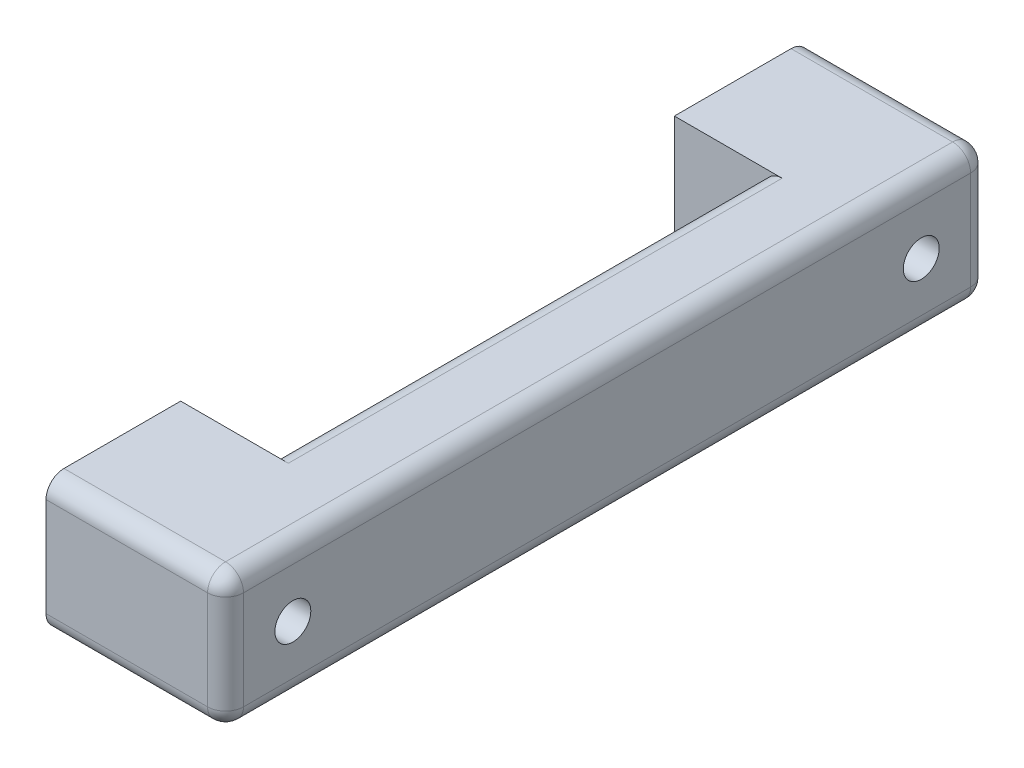
ISO-10303-21;
HEADER;
FILE_DESCRIPTION(('STEP AP214'),'2;1');
FILE_NAME('part.step','',(''),(''),'','','');
FILE_SCHEMA(('AUTOMOTIVE_DESIGN { 1 0 10303 214 1 1 1 1 }'));
ENDSEC;
DATA;
#1=APPLICATION_CONTEXT('core data for automotive mechanical design processes');
#2=APPLICATION_PROTOCOL_DEFINITION('international standard','automotive_design',2000,#1);
#3=PRODUCT_CONTEXT('',#1,'mechanical');
#4=PRODUCT('Part','Part','',(#3));
#5=PRODUCT_RELATED_PRODUCT_CATEGORY('part','',(#4));
#6=PRODUCT_DEFINITION_FORMATION('','',#4);
#7=PRODUCT_DEFINITION_CONTEXT('part definition',#1,'design');
#8=PRODUCT_DEFINITION('design','',#6,#7);
#9=PRODUCT_DEFINITION_SHAPE('','',#8);
#10=(LENGTH_UNIT() NAMED_UNIT(*) SI_UNIT(.MILLI.,.METRE.));
#11=(NAMED_UNIT(*) PLANE_ANGLE_UNIT() SI_UNIT($,.RADIAN.));
#12=(NAMED_UNIT(*) SI_UNIT($,.STERADIAN.) SOLID_ANGLE_UNIT());
#13=UNCERTAINTY_MEASURE_WITH_UNIT(LENGTH_MEASURE(1.E-05),#10,'distance_accuracy_value','');
#14=(GEOMETRIC_REPRESENTATION_CONTEXT(3) GLOBAL_UNCERTAINTY_ASSIGNED_CONTEXT((#13)) GLOBAL_UNIT_ASSIGNED_CONTEXT((#10,
#11,#12)) REPRESENTATION_CONTEXT('',''));
#15=CARTESIAN_POINT('',(0.,0.,0.));
#16=DIRECTION('',(0.,0.,1.));
#17=DIRECTION('',(1.,0.,0.));
#18=AXIS2_PLACEMENT_3D('',#15,#16,#17);
#19=CARTESIAN_POINT('',(0.,0.,0.));
#20=DIRECTION('',(1.,0.,0.));
#21=DIRECTION('',(0.,0.,-1.));
#22=AXIS2_PLACEMENT_3D('',#19,#20,#21);
#23=PLANE('',#22);
#24=DIRECTION('',(0.,-1.,0.));
#25=VECTOR('',#24,1.);
#26=CARTESIAN_POINT('',(0.,7.5,27.5));
#27=LINE('',#26,#25);
#28=CARTESIAN_POINT('',(0.,5.5,27.5));
#29=VERTEX_POINT('',#28);
#30=CARTESIAN_POINT('',(0.,-5.5,27.5));
#31=VERTEX_POINT('',#30);
#32=EDGE_CURVE('E187',#29,#31,#27,.T.);
#33=ORIENTED_EDGE('',*,*,#32,.F.);
#34=DIRECTION('',(0.,0.,1.));
#35=VECTOR('',#34,1.);
#36=CARTESIAN_POINT('',(0.,5.5,0.));
#37=LINE('',#36,#35);
#38=CARTESIAN_POINT('',(0.,5.5,-27.5));
#39=VERTEX_POINT('',#38);
#40=EDGE_CURVE('E215',#29,#39,#37,.F.);
#41=ORIENTED_EDGE('',*,*,#40,.T.);
#42=DIRECTION('',(0.,1.,0.));
#43=VECTOR('',#42,1.);
#44=CARTESIAN_POINT('',(0.,7.5,-27.5));
#45=LINE('',#44,#43);
#46=CARTESIAN_POINT('',(0.,-5.5,-27.5));
#47=VERTEX_POINT('',#46);
#48=EDGE_CURVE('E184',#47,#39,#45,.T.);
#49=ORIENTED_EDGE('',*,*,#48,.F.);
#50=DIRECTION('',(0.,0.,-1.));
#51=VECTOR('',#50,1.);
#52=CARTESIAN_POINT('',(0.,-5.5,0.));
#53=LINE('',#52,#51);
#54=EDGE_CURVE('E213',#47,#31,#53,.F.);
#55=ORIENTED_EDGE('',*,*,#54,.T.);
#56=EDGE_LOOP('',(#33,#41,#49,#55));
#57=FACE_BOUND('',#56,.T.);
#58=ADVANCED_FACE('F39',(#57),#23,.F.);
#59=CARTESIAN_POINT('',(10.,7.5,-42.5));
#60=DIRECTION('',(0.,0.,1.));
#61=DIRECTION('',(1.,0.,0.));
#62=AXIS2_PLACEMENT_3D('',#59,#60,#61);
#63=PLANE('',#62);
#64=DIRECTION('',(0.,1.,0.));
#65=VECTOR('',#64,1.);
#66=CARTESIAN_POINT('',(8.,-7.5,-42.5));
#67=LINE('',#66,#65);
#68=CARTESIAN_POINT('',(8.,5.5,-42.5));
#69=VERTEX_POINT('',#68);
#70=CARTESIAN_POINT('',(8.,-5.5,-42.5));
#71=VERTEX_POINT('',#70);
#72=EDGE_CURVE('E235',#69,#71,#67,.F.);
#73=ORIENTED_EDGE('',*,*,#72,.T.);
#74=DIRECTION('',(-1.,0.,0.));
#75=VECTOR('',#74,1.);
#76=CARTESIAN_POINT('',(10.,-5.5,-42.5));
#77=LINE('',#76,#75);
#78=CARTESIAN_POINT('',(-10.,-5.5,-42.5));
#79=VERTEX_POINT('',#78);
#80=EDGE_CURVE('E238',#71,#79,#77,.T.);
#81=ORIENTED_EDGE('',*,*,#80,.T.);
#82=DIRECTION('',(0.,-1.,0.));
#83=VECTOR('',#82,1.);
#84=CARTESIAN_POINT('',(-10.,7.5,-42.5));
#85=LINE('',#84,#83);
#86=CARTESIAN_POINT('',(-10.,5.5,-42.5));
#87=VERTEX_POINT('',#86);
#88=EDGE_CURVE('E164',#87,#79,#85,.T.);
#89=ORIENTED_EDGE('',*,*,#88,.F.);
#90=DIRECTION('',(-1.,0.,0.));
#91=VECTOR('',#90,1.);
#92=CARTESIAN_POINT('',(10.,5.5,-42.5));
#93=LINE('',#92,#91);
#94=EDGE_CURVE('E233',#87,#69,#93,.F.);
#95=ORIENTED_EDGE('',*,*,#94,.T.);
#96=EDGE_LOOP('',(#73,#81,#89,#95));
#97=FACE_BOUND('',#96,.T.);
#98=ADVANCED_FACE('F348',(#97),#63,.F.);
#99=CARTESIAN_POINT('',(10.,7.5,42.5));
#100=DIRECTION('',(0.,-1.,0.));
#101=DIRECTION('',(0.,0.,-1.));
#102=AXIS2_PLACEMENT_3D('',#99,#100,#101);
#103=PLANE('',#102);
#104=DIRECTION('',(0.,0.,1.));
#105=VECTOR('',#104,1.);
#106=CARTESIAN_POINT('',(2.,7.5,42.5));
#107=LINE('',#106,#105);
#108=CARTESIAN_POINT('',(2.,7.5,-27.5));
#109=VERTEX_POINT('',#108);
#110=CARTESIAN_POINT('',(2.,7.5,27.5));
#111=VERTEX_POINT('',#110);
#112=EDGE_CURVE('E210',#109,#111,#107,.T.);
#113=ORIENTED_EDGE('',*,*,#112,.T.);
#114=DIRECTION('',(1.,0.,0.));
#115=VECTOR('',#114,1.);
#116=CARTESIAN_POINT('',(-10.,7.5,27.5));
#117=LINE('',#116,#115);
#118=CARTESIAN_POINT('',(-10.,7.5,27.5));
#119=VERTEX_POINT('',#118);
#120=EDGE_CURVE('E189',#119,#111,#117,.T.);
#121=ORIENTED_EDGE('',*,*,#120,.F.);
#122=DIRECTION('',(0.,0.,-1.));
#123=VECTOR('',#122,1.);
#124=CARTESIAN_POINT('',(-10.,7.5,42.5));
#125=LINE('',#124,#123);
#126=CARTESIAN_POINT('',(-10.,7.5,40.5));
#127=VERTEX_POINT('',#126);
#128=EDGE_CURVE('E196',#127,#119,#125,.T.);
#129=ORIENTED_EDGE('',*,*,#128,.F.);
#130=DIRECTION('',(-1.,0.,0.));
#131=VECTOR('',#130,1.);
#132=CARTESIAN_POINT('',(10.,7.5,40.5));
#133=LINE('',#132,#131);
#134=CARTESIAN_POINT('',(8.,7.5,40.5));
#135=VERTEX_POINT('',#134);
#136=EDGE_CURVE('E208',#127,#135,#133,.F.);
#137=ORIENTED_EDGE('',*,*,#136,.T.);
#138=DIRECTION('',(0.,0.,1.));
#139=VECTOR('',#138,1.);
#140=CARTESIAN_POINT('',(8.,7.5,-42.5));
#141=LINE('',#140,#139);
#142=CARTESIAN_POINT('',(8.,7.5,-40.5));
#143=VERTEX_POINT('',#142);
#144=EDGE_CURVE('E206',#135,#143,#141,.F.);
#145=ORIENTED_EDGE('',*,*,#144,.T.);
#146=DIRECTION('',(-1.,0.,0.));
#147=VECTOR('',#146,1.);
#148=CARTESIAN_POINT('',(10.,7.5,-40.5));
#149=LINE('',#148,#147);
#150=CARTESIAN_POINT('',(-10.,7.5,-40.5));
#151=VERTEX_POINT('',#150);
#152=EDGE_CURVE('E173',#143,#151,#149,.T.);
#153=ORIENTED_EDGE('',*,*,#152,.T.);
#154=DIRECTION('',(0.,0.,-1.));
#155=VECTOR('',#154,1.);
#156=CARTESIAN_POINT('',(-10.,7.5,-42.5));
#157=LINE('',#156,#155);
#158=CARTESIAN_POINT('',(-10.,7.5,-27.5));
#159=VERTEX_POINT('',#158);
#160=EDGE_CURVE('E179',#159,#151,#157,.T.);
#161=ORIENTED_EDGE('',*,*,#160,.F.);
#162=DIRECTION('',(1.,0.,0.));
#163=VECTOR('',#162,1.);
#164=CARTESIAN_POINT('',(-10.,7.5,-27.5));
#165=LINE('',#164,#163);
#166=EDGE_CURVE('E174',#159,#109,#165,.T.);
#167=ORIENTED_EDGE('',*,*,#166,.T.);
#168=EDGE_LOOP('',(#113,#121,#129,#137,#145,#153,#161,#167));
#169=FACE_BOUND('',#168,.T.);
#170=ADVANCED_FACE('F341',(#169),#103,.F.);
#171=CARTESIAN_POINT('',(10.,7.5,42.5));
#172=DIRECTION('',(0.,0.,-1.));
#173=DIRECTION('',(-1.,0.,0.));
#174=AXIS2_PLACEMENT_3D('',#171,#172,#173);
#175=PLANE('',#174);
#176=DIRECTION('',(0.,1.,0.));
#177=VECTOR('',#176,1.);
#178=CARTESIAN_POINT('',(-10.,7.5,42.5));
#179=LINE('',#178,#177);
#180=CARTESIAN_POINT('',(-10.,-5.5,42.5));
#181=VERTEX_POINT('',#180);
#182=CARTESIAN_POINT('',(-10.,5.5,42.5));
#183=VERTEX_POINT('',#182);
#184=EDGE_CURVE('E193',#181,#183,#179,.T.);
#185=ORIENTED_EDGE('',*,*,#184,.F.);
#186=DIRECTION('',(-1.,0.,0.));
#187=VECTOR('',#186,1.);
#188=CARTESIAN_POINT('',(10.,-5.5,42.5));
#189=LINE('',#188,#187);
#190=CARTESIAN_POINT('',(8.,-5.5,42.5));
#191=VERTEX_POINT('',#190);
#192=EDGE_CURVE('E61',#181,#191,#189,.F.);
#193=ORIENTED_EDGE('',*,*,#192,.T.);
#194=DIRECTION('',(0.,-1.,0.));
#195=VECTOR('',#194,1.);
#196=CARTESIAN_POINT('',(8.,7.5,42.5));
#197=LINE('',#196,#195);
#198=CARTESIAN_POINT('',(8.,5.5,42.5));
#199=VERTEX_POINT('',#198);
#200=EDGE_CURVE('E56',#191,#199,#197,.F.);
#201=ORIENTED_EDGE('',*,*,#200,.T.);
#202=DIRECTION('',(-1.,0.,0.));
#203=VECTOR('',#202,1.);
#204=CARTESIAN_POINT('',(10.,5.5,42.5));
#205=LINE('',#204,#203);
#206=EDGE_CURVE('E248',#199,#183,#205,.T.);
#207=ORIENTED_EDGE('',*,*,#206,.T.);
#208=EDGE_LOOP('',(#185,#193,#201,#207));
#209=FACE_BOUND('',#208,.T.);
#210=ADVANCED_FACE('F318',(#209),#175,.F.);
#211=CARTESIAN_POINT('',(10.,-7.5,42.5));
#212=DIRECTION('',(0.,1.,0.));
#213=DIRECTION('',(0.,0.,1.));
#214=AXIS2_PLACEMENT_3D('',#211,#212,#213);
#215=PLANE('',#214);
#216=DIRECTION('',(0.,0.,-1.));
#217=VECTOR('',#216,1.);
#218=CARTESIAN_POINT('',(2.,-7.5,42.5));
#219=LINE('',#218,#217);
#220=CARTESIAN_POINT('',(2.,-7.5,27.5));
#221=VERTEX_POINT('',#220);
#222=CARTESIAN_POINT('',(2.,-7.5,-27.5));
#223=VERTEX_POINT('',#222);
#224=EDGE_CURVE('E170',#221,#223,#219,.T.);
#225=ORIENTED_EDGE('',*,*,#224,.T.);
#226=DIRECTION('',(1.,0.,0.));
#227=VECTOR('',#226,1.);
#228=CARTESIAN_POINT('',(-10.,-7.5,-27.5));
#229=LINE('',#228,#227);
#230=CARTESIAN_POINT('',(-10.,-7.5,-27.5));
#231=VERTEX_POINT('',#230);
#232=EDGE_CURVE('E167',#231,#223,#229,.T.);
#233=ORIENTED_EDGE('',*,*,#232,.F.);
#234=DIRECTION('',(0.,0.,1.));
#235=VECTOR('',#234,1.);
#236=CARTESIAN_POINT('',(-10.,-7.5,-42.5));
#237=LINE('',#236,#235);
#238=CARTESIAN_POINT('',(-10.,-7.5,-40.5));
#239=VERTEX_POINT('',#238);
#240=EDGE_CURVE('E152',#239,#231,#237,.T.);
#241=ORIENTED_EDGE('',*,*,#240,.F.);
#242=DIRECTION('',(-1.,0.,0.));
#243=VECTOR('',#242,1.);
#244=CARTESIAN_POINT('',(10.,-7.5,-40.5));
#245=LINE('',#244,#243);
#246=CARTESIAN_POINT('',(8.,-7.5,-40.5));
#247=VERTEX_POINT('',#246);
#248=EDGE_CURVE('E221',#239,#247,#245,.F.);
#249=ORIENTED_EDGE('',*,*,#248,.T.);
#250=DIRECTION('',(0.,0.,-1.));
#251=VECTOR('',#250,1.);
#252=CARTESIAN_POINT('',(8.,-7.5,42.5));
#253=LINE('',#252,#251);
#254=CARTESIAN_POINT('',(8.,-7.5,40.5));
#255=VERTEX_POINT('',#254);
#256=EDGE_CURVE('E219',#247,#255,#253,.F.);
#257=ORIENTED_EDGE('',*,*,#256,.T.);
#258=DIRECTION('',(-1.,0.,0.));
#259=VECTOR('',#258,1.);
#260=CARTESIAN_POINT('',(10.,-7.5,40.5));
#261=LINE('',#260,#259);
#262=CARTESIAN_POINT('',(-10.,-7.5,40.5));
#263=VERTEX_POINT('',#262);
#264=EDGE_CURVE('E217',#255,#263,#261,.T.);
#265=ORIENTED_EDGE('',*,*,#264,.T.);
#266=DIRECTION('',(0.,0.,1.));
#267=VECTOR('',#266,1.);
#268=CARTESIAN_POINT('',(-10.,-7.5,42.5));
#269=LINE('',#268,#267);
#270=CARTESIAN_POINT('',(-10.,-7.5,27.5));
#271=VERTEX_POINT('',#270);
#272=EDGE_CURVE('E199',#271,#263,#269,.T.);
#273=ORIENTED_EDGE('',*,*,#272,.F.);
#274=DIRECTION('',(1.,0.,0.));
#275=VECTOR('',#274,1.);
#276=CARTESIAN_POINT('',(-10.,-7.5,27.5));
#277=LINE('',#276,#275);
#278=EDGE_CURVE('E191',#271,#221,#277,.T.);
#279=ORIENTED_EDGE('',*,*,#278,.T.);
#280=EDGE_LOOP('',(#225,#233,#241,#249,#257,#265,#273,#279));
#281=FACE_BOUND('',#280,.T.);
#282=ADVANCED_FACE('F168',(#281),#215,.F.);
#283=CARTESIAN_POINT('',(10.,0.,0.));
#284=DIRECTION('',(1.,0.,0.));
#285=DIRECTION('',(0.,0.,-1.));
#286=AXIS2_PLACEMENT_3D('',#283,#284,#285);
#287=PLANE('',#286);
#288=CARTESIAN_POINT('',(10.,0.,-35.));
#289=DIRECTION('',(-1.,0.,0.));
#290=DIRECTION('',(0.,0.,1.));
#291=AXIS2_PLACEMENT_3D('',#288,#289,#290);
#292=CIRCLE('',#291,2.);
#293=CARTESIAN_POINT('',(10.,0.,-33.));
#294=VERTEX_POINT('',#293);
#295=EDGE_CURVE('E259',#294,#294,#292,.T.);
#296=ORIENTED_EDGE('',*,*,#295,.T.);
#297=EDGE_LOOP('',(#296));
#298=FACE_BOUND('',#297,.T.);
#299=CARTESIAN_POINT('',(10.,0.,35.));
#300=DIRECTION('',(-1.,0.,0.));
#301=DIRECTION('',(0.,0.,-1.));
#302=AXIS2_PLACEMENT_3D('',#299,#300,#301);
#303=CIRCLE('',#302,2.);
#304=CARTESIAN_POINT('',(10.,0.,33.));
#305=VERTEX_POINT('',#304);
#306=EDGE_CURVE('E350',#305,#305,#303,.T.);
#307=ORIENTED_EDGE('',*,*,#306,.T.);
#308=EDGE_LOOP('',(#307));
#309=FACE_BOUND('',#308,.T.);
#310=DIRECTION('',(0.,0.,-1.));
#311=VECTOR('',#310,1.);
#312=CARTESIAN_POINT('',(10.,-5.5,-42.5));
#313=LINE('',#312,#311);
#314=CARTESIAN_POINT('',(10.,-5.5,40.5));
#315=VERTEX_POINT('',#314);
#316=CARTESIAN_POINT('',(10.,-5.5,-40.5));
#317=VERTEX_POINT('',#316);
#318=EDGE_CURVE('E226',#315,#317,#313,.T.);
#319=ORIENTED_EDGE('',*,*,#318,.T.);
#320=DIRECTION('',(0.,1.,0.));
#321=VECTOR('',#320,1.);
#322=CARTESIAN_POINT('',(10.,7.5,-40.5));
#323=LINE('',#322,#321);
#324=CARTESIAN_POINT('',(10.,5.5,-40.5));
#325=VERTEX_POINT('',#324);
#326=EDGE_CURVE('E230',#317,#325,#323,.T.);
#327=ORIENTED_EDGE('',*,*,#326,.T.);
#328=DIRECTION('',(0.,0.,1.));
#329=VECTOR('',#328,1.);
#330=CARTESIAN_POINT('',(10.,5.5,42.5));
#331=LINE('',#330,#329);
#332=CARTESIAN_POINT('',(10.,5.5,40.5));
#333=VERTEX_POINT('',#332);
#334=EDGE_CURVE('E228',#325,#333,#331,.T.);
#335=ORIENTED_EDGE('',*,*,#334,.T.);
#336=DIRECTION('',(0.,-1.,0.));
#337=VECTOR('',#336,1.);
#338=CARTESIAN_POINT('',(10.,-7.5,40.5));
#339=LINE('',#338,#337);
#340=EDGE_CURVE('E224',#333,#315,#339,.T.);
#341=ORIENTED_EDGE('',*,*,#340,.T.);
#342=EDGE_LOOP('',(#319,#327,#335,#341));
#343=FACE_BOUND('',#342,.T.);
#344=ADVANCED_FACE('F302',(#298,#309,#343),#287,.T.);
#345=CARTESIAN_POINT('',(-10.,7.5,27.5));
#346=DIRECTION('',(0.,0.,1.));
#347=DIRECTION('',(1.,0.,0.));
#348=AXIS2_PLACEMENT_3D('',#345,#346,#347);
#349=PLANE('',#348);
#350=ORIENTED_EDGE('',*,*,#120,.T.);
#351=CARTESIAN_POINT('',(2.,5.5,27.5));
#352=DIRECTION('',(0.,0.,1.));
#353=DIRECTION('',(1.,0.,0.));
#354=AXIS2_PLACEMENT_3D('',#351,#352,#353);
#355=CIRCLE('',#354,2.);
#356=EDGE_CURVE('E251',#111,#29,#355,.T.);
#357=ORIENTED_EDGE('',*,*,#356,.T.);
#358=ORIENTED_EDGE('',*,*,#32,.T.);
#359=CARTESIAN_POINT('',(2.,-5.5,27.5));
#360=DIRECTION('',(0.,0.,1.));
#361=DIRECTION('',(1.,0.,0.));
#362=AXIS2_PLACEMENT_3D('',#359,#360,#361);
#363=CIRCLE('',#362,2.);
#364=EDGE_CURVE('E11',#31,#221,#363,.T.);
#365=ORIENTED_EDGE('',*,*,#364,.T.);
#366=ORIENTED_EDGE('',*,*,#278,.F.);
#367=DIRECTION('',(0.,-1.,0.));
#368=VECTOR('',#367,1.);
#369=CARTESIAN_POINT('',(-10.,7.5,27.5));
#370=LINE('',#369,#368);
#371=EDGE_CURVE('E202',#119,#271,#370,.T.);
#372=ORIENTED_EDGE('',*,*,#371,.F.);
#373=EDGE_LOOP('',(#350,#357,#358,#365,#366,#372));
#374=FACE_BOUND('',#373,.T.);
#375=ADVANCED_FACE('F449',(#374),#349,.F.);
#376=CARTESIAN_POINT('',(-10.,0.,0.));
#377=DIRECTION('',(-1.,0.,0.));
#378=DIRECTION('',(0.,0.,1.));
#379=AXIS2_PLACEMENT_3D('',#376,#377,#378);
#380=PLANE('',#379);
#381=CARTESIAN_POINT('',(-10.,0.,35.));
#382=DIRECTION('',(-1.,0.,0.));
#383=DIRECTION('',(0.,0.,-1.));
#384=AXIS2_PLACEMENT_3D('',#381,#382,#383);
#385=CIRCLE('',#384,2.);
#386=CARTESIAN_POINT('',(-10.,0.,33.));
#387=VERTEX_POINT('',#386);
#388=EDGE_CURVE('E353',#387,#387,#385,.T.);
#389=ORIENTED_EDGE('',*,*,#388,.F.);
#390=EDGE_LOOP('',(#389));
#391=FACE_BOUND('',#390,.T.);
#392=ORIENTED_EDGE('',*,*,#272,.T.);
#393=CARTESIAN_POINT('',(-10.,-5.5,40.5));
#394=DIRECTION('',(-1.,0.,0.));
#395=DIRECTION('',(0.,0.,1.));
#396=AXIS2_PLACEMENT_3D('',#393,#394,#395);
#397=CIRCLE('',#396,2.);
#398=EDGE_CURVE('E245',#263,#181,#397,.T.);
#399=ORIENTED_EDGE('',*,*,#398,.T.);
#400=ORIENTED_EDGE('',*,*,#184,.T.);
#401=CARTESIAN_POINT('',(-10.,5.5,40.5));
#402=DIRECTION('',(-1.,0.,0.));
#403=DIRECTION('',(0.,0.,1.));
#404=AXIS2_PLACEMENT_3D('',#401,#402,#403);
#405=CIRCLE('',#404,2.);
#406=EDGE_CURVE('E243',#183,#127,#405,.T.);
#407=ORIENTED_EDGE('',*,*,#406,.T.);
#408=ORIENTED_EDGE('',*,*,#128,.T.);
#409=ORIENTED_EDGE('',*,*,#371,.T.);
#410=EDGE_LOOP('',(#392,#399,#400,#407,#408,#409));
#411=FACE_BOUND('',#410,.T.);
#412=ADVANCED_FACE('F320',(#391,#411),#380,.T.);
#413=CARTESIAN_POINT('',(-10.,7.5,-27.5));
#414=DIRECTION('',(0.,0.,-1.));
#415=DIRECTION('',(-1.,0.,0.));
#416=AXIS2_PLACEMENT_3D('',#413,#414,#415);
#417=PLANE('',#416);
#418=ORIENTED_EDGE('',*,*,#232,.T.);
#419=CARTESIAN_POINT('',(2.,-5.5,-27.5));
#420=DIRECTION('',(0.,0.,-1.));
#421=DIRECTION('',(-1.,0.,0.));
#422=AXIS2_PLACEMENT_3D('',#419,#420,#421);
#423=CIRCLE('',#422,2.);
#424=EDGE_CURVE('E48',#223,#47,#423,.T.);
#425=ORIENTED_EDGE('',*,*,#424,.T.);
#426=ORIENTED_EDGE('',*,*,#48,.T.);
#427=CARTESIAN_POINT('',(2.,5.5,-27.5));
#428=DIRECTION('',(0.,0.,-1.));
#429=DIRECTION('',(-1.,0.,0.));
#430=AXIS2_PLACEMENT_3D('',#427,#428,#429);
#431=CIRCLE('',#430,2.);
#432=EDGE_CURVE('E253',#39,#109,#431,.T.);
#433=ORIENTED_EDGE('',*,*,#432,.T.);
#434=ORIENTED_EDGE('',*,*,#166,.F.);
#435=DIRECTION('',(0.,1.,0.));
#436=VECTOR('',#435,1.);
#437=CARTESIAN_POINT('',(-10.,7.5,-27.5));
#438=LINE('',#437,#436);
#439=EDGE_CURVE('E158',#231,#159,#438,.T.);
#440=ORIENTED_EDGE('',*,*,#439,.F.);
#441=EDGE_LOOP('',(#418,#425,#426,#433,#434,#440));
#442=FACE_BOUND('',#441,.T.);
#443=ADVANCED_FACE('F176',(#442),#417,.F.);
#444=CARTESIAN_POINT('',(-10.,0.,0.));
#445=DIRECTION('',(-1.,0.,0.));
#446=DIRECTION('',(0.,0.,1.));
#447=AXIS2_PLACEMENT_3D('',#444,#445,#446);
#448=PLANE('',#447);
#449=CARTESIAN_POINT('',(-10.,0.,-35.));
#450=DIRECTION('',(-1.,0.,0.));
#451=DIRECTION('',(0.,0.,1.));
#452=AXIS2_PLACEMENT_3D('',#449,#450,#451);
#453=CIRCLE('',#452,2.);
#454=CARTESIAN_POINT('',(-10.,0.,-33.));
#455=VERTEX_POINT('',#454);
#456=EDGE_CURVE('E356',#455,#455,#453,.T.);
#457=ORIENTED_EDGE('',*,*,#456,.F.);
#458=EDGE_LOOP('',(#457));
#459=FACE_BOUND('',#458,.T.);
#460=ORIENTED_EDGE('',*,*,#88,.T.);
#461=CARTESIAN_POINT('',(-10.,-5.5,-40.5));
#462=DIRECTION('',(-1.,0.,0.));
#463=DIRECTION('',(0.,0.,1.));
#464=AXIS2_PLACEMENT_3D('',#461,#462,#463);
#465=CIRCLE('',#464,2.);
#466=EDGE_CURVE('E161',#79,#239,#465,.T.);
#467=ORIENTED_EDGE('',*,*,#466,.T.);
#468=ORIENTED_EDGE('',*,*,#240,.T.);
#469=ORIENTED_EDGE('',*,*,#439,.T.);
#470=ORIENTED_EDGE('',*,*,#160,.T.);
#471=CARTESIAN_POINT('',(-10.,5.5,-40.5));
#472=DIRECTION('',(-1.,0.,0.));
#473=DIRECTION('',(0.,0.,1.));
#474=AXIS2_PLACEMENT_3D('',#471,#472,#473);
#475=CIRCLE('',#474,2.);
#476=EDGE_CURVE('E240',#151,#87,#475,.T.);
#477=ORIENTED_EDGE('',*,*,#476,.T.);
#478=EDGE_LOOP('',(#460,#467,#468,#469,#470,#477));
#479=FACE_BOUND('',#478,.T.);
#480=ADVANCED_FACE('F155',(#459,#479),#448,.T.);
#481=CARTESIAN_POINT('',(2.,5.5,42.5));
#482=DIRECTION('',(0.,0.,1.));
#483=DIRECTION('',(1.,0.,0.));
#484=AXIS2_PLACEMENT_3D('',#481,#482,#483);
#485=CYLINDRICAL_SURFACE('',#484,2.);
#486=ORIENTED_EDGE('',*,*,#432,.F.);
#487=ORIENTED_EDGE('',*,*,#40,.F.);
#488=ORIENTED_EDGE('',*,*,#356,.F.);
#489=ORIENTED_EDGE('',*,*,#112,.F.);
#490=EDGE_LOOP('',(#486,#487,#488,#489));
#491=FACE_BOUND('',#490,.T.);
#492=ADVANCED_FACE('F372',(#491),#485,.T.);
#493=CARTESIAN_POINT('',(2.,-5.5,42.5));
#494=DIRECTION('',(0.,0.,-1.));
#495=DIRECTION('',(-1.,0.,0.));
#496=AXIS2_PLACEMENT_3D('',#493,#494,#495);
#497=CYLINDRICAL_SURFACE('',#496,2.);
#498=ORIENTED_EDGE('',*,*,#364,.F.);
#499=ORIENTED_EDGE('',*,*,#54,.F.);
#500=ORIENTED_EDGE('',*,*,#424,.F.);
#501=ORIENTED_EDGE('',*,*,#224,.F.);
#502=EDGE_LOOP('',(#498,#499,#500,#501));
#503=FACE_BOUND('',#502,.T.);
#504=ADVANCED_FACE('F378',(#503),#497,.T.);
#505=CARTESIAN_POINT('',(10.,-5.5,40.5));
#506=DIRECTION('',(-1.,0.,0.));
#507=DIRECTION('',(0.,0.,1.));
#508=AXIS2_PLACEMENT_3D('',#505,#506,#507);
#509=CYLINDRICAL_SURFACE('',#508,2.);
#510=ORIENTED_EDGE('',*,*,#398,.F.);
#511=ORIENTED_EDGE('',*,*,#264,.F.);
#512=CARTESIAN_POINT('',(8.,-5.5,40.5));
#513=DIRECTION('',(1.,0.,0.));
#514=DIRECTION('',(0.,0.,-1.));
#515=AXIS2_PLACEMENT_3D('',#512,#513,#514);
#516=CIRCLE('',#515,2.);
#517=EDGE_CURVE('E43',#191,#255,#516,.T.);
#518=ORIENTED_EDGE('',*,*,#517,.F.);
#519=ORIENTED_EDGE('',*,*,#192,.F.);
#520=EDGE_LOOP('',(#510,#511,#518,#519));
#521=FACE_BOUND('',#520,.T.);
#522=ADVANCED_FACE('F41',(#521),#509,.T.);
#523=CARTESIAN_POINT('',(8.,0.,40.5));
#524=DIRECTION('',(0.,1.,0.));
#525=DIRECTION('',(0.,0.,1.));
#526=AXIS2_PLACEMENT_3D('',#523,#524,#525);
#527=CYLINDRICAL_SURFACE('',#526,2.);
#528=CARTESIAN_POINT('',(8.,5.5,40.5));
#529=DIRECTION('',(0.,1.,0.));
#530=DIRECTION('',(0.,0.,1.));
#531=AXIS2_PLACEMENT_3D('',#528,#529,#530);
#532=CIRCLE('',#531,2.);
#533=EDGE_CURVE('E282',#199,#333,#532,.T.);
#534=ORIENTED_EDGE('',*,*,#533,.F.);
#535=ORIENTED_EDGE('',*,*,#200,.F.);
#536=CARTESIAN_POINT('',(8.,-5.5,40.5));
#537=DIRECTION('',(0.,-1.,0.));
#538=DIRECTION('',(0.,0.,-1.));
#539=AXIS2_PLACEMENT_3D('',#536,#537,#538);
#540=CIRCLE('',#539,2.);
#541=EDGE_CURVE('E284',#315,#191,#540,.T.);
#542=ORIENTED_EDGE('',*,*,#541,.F.);
#543=ORIENTED_EDGE('',*,*,#340,.F.);
#544=EDGE_LOOP('',(#534,#535,#542,#543));
#545=FACE_BOUND('',#544,.T.);
#546=ADVANCED_FACE('F308',(#545),#527,.T.);
#547=CARTESIAN_POINT('',(10.,5.5,40.5));
#548=DIRECTION('',(-1.,0.,0.));
#549=DIRECTION('',(0.,0.,1.));
#550=AXIS2_PLACEMENT_3D('',#547,#548,#549);
#551=CYLINDRICAL_SURFACE('',#550,2.);
#552=ORIENTED_EDGE('',*,*,#406,.F.);
#553=ORIENTED_EDGE('',*,*,#206,.F.);
#554=CARTESIAN_POINT('',(8.,5.5,40.5));
#555=DIRECTION('',(1.,0.,0.));
#556=DIRECTION('',(0.,0.,-1.));
#557=AXIS2_PLACEMENT_3D('',#554,#555,#556);
#558=CIRCLE('',#557,2.);
#559=EDGE_CURVE('E279',#135,#199,#558,.T.);
#560=ORIENTED_EDGE('',*,*,#559,.F.);
#561=ORIENTED_EDGE('',*,*,#136,.F.);
#562=EDGE_LOOP('',(#552,#553,#560,#561));
#563=FACE_BOUND('',#562,.T.);
#564=ADVANCED_FACE('F317',(#563),#551,.T.);
#565=CARTESIAN_POINT('',(8.,-5.5,40.5));
#566=DIRECTION('',(0.,0.,1.));
#567=DIRECTION('',(1.,0.,0.));
#568=AXIS2_PLACEMENT_3D('',#565,#566,#567);
#569=SPHERICAL_SURFACE('',#568,2.);
#570=ORIENTED_EDGE('',*,*,#541,.T.);
#571=ORIENTED_EDGE('',*,*,#517,.T.);
#572=CARTESIAN_POINT('',(8.,-5.5,40.5));
#573=DIRECTION('',(0.,0.,1.));
#574=DIRECTION('',(1.,0.,0.));
#575=AXIS2_PLACEMENT_3D('',#572,#573,#574);
#576=CIRCLE('',#575,2.);
#577=EDGE_CURVE('E276',#315,#255,#576,.F.);
#578=ORIENTED_EDGE('',*,*,#577,.F.);
#579=EDGE_LOOP('',(#570,#571,#578));
#580=FACE_BOUND('',#579,.T.);
#581=ADVANCED_FACE('F291',(#580),#569,.T.);
#582=CARTESIAN_POINT('',(8.,5.5,40.5));
#583=DIRECTION('',(0.,0.,1.));
#584=DIRECTION('',(1.,0.,0.));
#585=AXIS2_PLACEMENT_3D('',#582,#583,#584);
#586=SPHERICAL_SURFACE('',#585,2.);
#587=ORIENTED_EDGE('',*,*,#559,.T.);
#588=ORIENTED_EDGE('',*,*,#533,.T.);
#589=CARTESIAN_POINT('',(8.,5.5,40.5));
#590=DIRECTION('',(0.,0.,1.));
#591=DIRECTION('',(1.,0.,0.));
#592=AXIS2_PLACEMENT_3D('',#589,#590,#591);
#593=CIRCLE('',#592,2.);
#594=EDGE_CURVE('E273',#135,#333,#593,.F.);
#595=ORIENTED_EDGE('',*,*,#594,.F.);
#596=EDGE_LOOP('',(#587,#588,#595));
#597=FACE_BOUND('',#596,.T.);
#598=ADVANCED_FACE('F312',(#597),#586,.T.);
#599=CARTESIAN_POINT('',(10.,-5.5,-40.5));
#600=DIRECTION('',(-1.,0.,0.));
#601=DIRECTION('',(0.,0.,1.));
#602=AXIS2_PLACEMENT_3D('',#599,#600,#601);
#603=CYLINDRICAL_SURFACE('',#602,2.);
#604=ORIENTED_EDGE('',*,*,#466,.F.);
#605=ORIENTED_EDGE('',*,*,#80,.F.);
#606=CARTESIAN_POINT('',(8.,-5.5,-40.5));
#607=DIRECTION('',(1.,0.,0.));
#608=DIRECTION('',(0.,0.,-1.));
#609=AXIS2_PLACEMENT_3D('',#606,#607,#608);
#610=CIRCLE('',#609,2.);
#611=EDGE_CURVE('E270',#247,#71,#610,.T.);
#612=ORIENTED_EDGE('',*,*,#611,.F.);
#613=ORIENTED_EDGE('',*,*,#248,.F.);
#614=EDGE_LOOP('',(#604,#605,#612,#613));
#615=FACE_BOUND('',#614,.T.);
#616=ADVANCED_FACE('F325',(#615),#603,.T.);
#617=CARTESIAN_POINT('',(8.,-5.5,0.));
#618=DIRECTION('',(0.,0.,1.));
#619=DIRECTION('',(1.,0.,0.));
#620=AXIS2_PLACEMENT_3D('',#617,#618,#619);
#621=CYLINDRICAL_SURFACE('',#620,2.);
#622=ORIENTED_EDGE('',*,*,#577,.T.);
#623=ORIENTED_EDGE('',*,*,#256,.F.);
#624=CARTESIAN_POINT('',(8.,-5.5,-40.5));
#625=DIRECTION('',(0.,0.,-1.));
#626=DIRECTION('',(-1.,0.,0.));
#627=AXIS2_PLACEMENT_3D('',#624,#625,#626);
#628=CIRCLE('',#627,2.);
#629=EDGE_CURVE('E267',#317,#247,#628,.T.);
#630=ORIENTED_EDGE('',*,*,#629,.F.);
#631=ORIENTED_EDGE('',*,*,#318,.F.);
#632=EDGE_LOOP('',(#622,#623,#630,#631));
#633=FACE_BOUND('',#632,.T.);
#634=ADVANCED_FACE('F297',(#633),#621,.T.);
#635=CARTESIAN_POINT('',(8.,5.5,0.));
#636=DIRECTION('',(0.,0.,-1.));
#637=DIRECTION('',(-1.,0.,0.));
#638=AXIS2_PLACEMENT_3D('',#635,#636,#637);
#639=CYLINDRICAL_SURFACE('',#638,2.);
#640=ORIENTED_EDGE('',*,*,#594,.T.);
#641=ORIENTED_EDGE('',*,*,#334,.F.);
#642=CARTESIAN_POINT('',(8.,5.5,-40.5));
#643=DIRECTION('',(0.,0.,-1.));
#644=DIRECTION('',(-1.,0.,0.));
#645=AXIS2_PLACEMENT_3D('',#642,#643,#644);
#646=CIRCLE('',#645,2.);
#647=EDGE_CURVE('E264',#143,#325,#646,.T.);
#648=ORIENTED_EDGE('',*,*,#647,.F.);
#649=ORIENTED_EDGE('',*,*,#144,.F.);
#650=EDGE_LOOP('',(#640,#641,#648,#649));
#651=FACE_BOUND('',#650,.T.);
#652=ADVANCED_FACE('F338',(#651),#639,.T.);
#653=CARTESIAN_POINT('',(10.,5.5,-40.5));
#654=DIRECTION('',(-1.,0.,0.));
#655=DIRECTION('',(0.,0.,1.));
#656=AXIS2_PLACEMENT_3D('',#653,#654,#655);
#657=CYLINDRICAL_SURFACE('',#656,2.);
#658=ORIENTED_EDGE('',*,*,#476,.F.);
#659=ORIENTED_EDGE('',*,*,#152,.F.);
#660=CARTESIAN_POINT('',(8.,5.5,-40.5));
#661=DIRECTION('',(1.,0.,0.));
#662=DIRECTION('',(0.,0.,-1.));
#663=AXIS2_PLACEMENT_3D('',#660,#661,#662);
#664=CIRCLE('',#663,2.);
#665=EDGE_CURVE('E261',#69,#143,#664,.T.);
#666=ORIENTED_EDGE('',*,*,#665,.F.);
#667=ORIENTED_EDGE('',*,*,#94,.F.);
#668=EDGE_LOOP('',(#658,#659,#666,#667));
#669=FACE_BOUND('',#668,.T.);
#670=ADVANCED_FACE('F344',(#669),#657,.T.);
#671=CARTESIAN_POINT('',(8.,-5.5,-40.5));
#672=DIRECTION('',(0.,-1.,0.));
#673=DIRECTION('',(0.,0.,-1.));
#674=AXIS2_PLACEMENT_3D('',#671,#672,#673);
#675=SPHERICAL_SURFACE('',#674,2.);
#676=ORIENTED_EDGE('',*,*,#629,.T.);
#677=ORIENTED_EDGE('',*,*,#611,.T.);
#678=CARTESIAN_POINT('',(8.,-5.5,-40.5));
#679=DIRECTION('',(0.,-1.,0.));
#680=DIRECTION('',(0.,0.,-1.));
#681=AXIS2_PLACEMENT_3D('',#678,#679,#680);
#682=CIRCLE('',#681,2.);
#683=EDGE_CURVE('E258',#317,#71,#682,.F.);
#684=ORIENTED_EDGE('',*,*,#683,.F.);
#685=EDGE_LOOP('',(#676,#677,#684));
#686=FACE_BOUND('',#685,.T.);
#687=ADVANCED_FACE('F328',(#686),#675,.T.);
#688=CARTESIAN_POINT('',(8.,5.5,-40.5));
#689=DIRECTION('',(0.,1.,0.));
#690=DIRECTION('',(0.,0.,1.));
#691=AXIS2_PLACEMENT_3D('',#688,#689,#690);
#692=SPHERICAL_SURFACE('',#691,2.);
#693=ORIENTED_EDGE('',*,*,#665,.T.);
#694=ORIENTED_EDGE('',*,*,#647,.T.);
#695=CARTESIAN_POINT('',(8.,5.5,-40.5));
#696=DIRECTION('',(0.,1.,0.));
#697=DIRECTION('',(0.,0.,1.));
#698=AXIS2_PLACEMENT_3D('',#695,#696,#697);
#699=CIRCLE('',#698,2.);
#700=EDGE_CURVE('E256',#69,#325,#699,.F.);
#701=ORIENTED_EDGE('',*,*,#700,.F.);
#702=EDGE_LOOP('',(#693,#694,#701));
#703=FACE_BOUND('',#702,.T.);
#704=ADVANCED_FACE('F335',(#703),#692,.T.);
#705=CARTESIAN_POINT('',(8.,0.,-40.5));
#706=DIRECTION('',(0.,-1.,0.));
#707=DIRECTION('',(0.,0.,-1.));
#708=AXIS2_PLACEMENT_3D('',#705,#706,#707);
#709=CYLINDRICAL_SURFACE('',#708,2.);
#710=ORIENTED_EDGE('',*,*,#683,.T.);
#711=ORIENTED_EDGE('',*,*,#72,.F.);
#712=ORIENTED_EDGE('',*,*,#700,.T.);
#713=ORIENTED_EDGE('',*,*,#326,.F.);
#714=EDGE_LOOP('',(#710,#711,#712,#713));
#715=FACE_BOUND('',#714,.T.);
#716=ADVANCED_FACE('F331',(#715),#709,.T.);
#717=CARTESIAN_POINT('',(10.,0.,-35.));
#718=DIRECTION('',(-1.,0.,0.));
#719=DIRECTION('',(0.,0.,1.));
#720=AXIS2_PLACEMENT_3D('',#717,#718,#719);
#721=CYLINDRICAL_SURFACE('',#720,2.);
#722=ORIENTED_EDGE('',*,*,#295,.F.);
#723=EDGE_LOOP('',(#722));
#724=FACE_BOUND('',#723,.T.);
#725=ORIENTED_EDGE('',*,*,#456,.T.);
#726=EDGE_LOOP('',(#725));
#727=FACE_BOUND('',#726,.T.);
#728=ADVANCED_FACE('F364',(#724,#727),#721,.F.);
#729=CARTESIAN_POINT('',(10.,0.,35.));
#730=DIRECTION('',(-1.,0.,0.));
#731=DIRECTION('',(0.,0.,1.));
#732=AXIS2_PLACEMENT_3D('',#729,#730,#731);
#733=CYLINDRICAL_SURFACE('',#732,2.);
#734=ORIENTED_EDGE('',*,*,#306,.F.);
#735=EDGE_LOOP('',(#734));
#736=FACE_BOUND('',#735,.T.);
#737=ORIENTED_EDGE('',*,*,#388,.T.);
#738=EDGE_LOOP('',(#737));
#739=FACE_BOUND('',#738,.T.);
#740=ADVANCED_FACE('F367',(#736,#739),#733,.F.);
#741=CLOSED_SHELL('',(#58,#98,#170,#210,#282,#344,#375,#412,#443,#480,#492,#504,#522,#546,#564,
#581,#598,#616,#634,#652,#670,#687,#704,#716,#728,#740));
#742=MANIFOLD_SOLID_BREP('B2',#741);
#743=ADVANCED_BREP_SHAPE_REPRESENTATION('',(#18,#742),#14);
#744=SHAPE_DEFINITION_REPRESENTATION(#9,#743);
ENDSEC;
END-ISO-10303-21;
